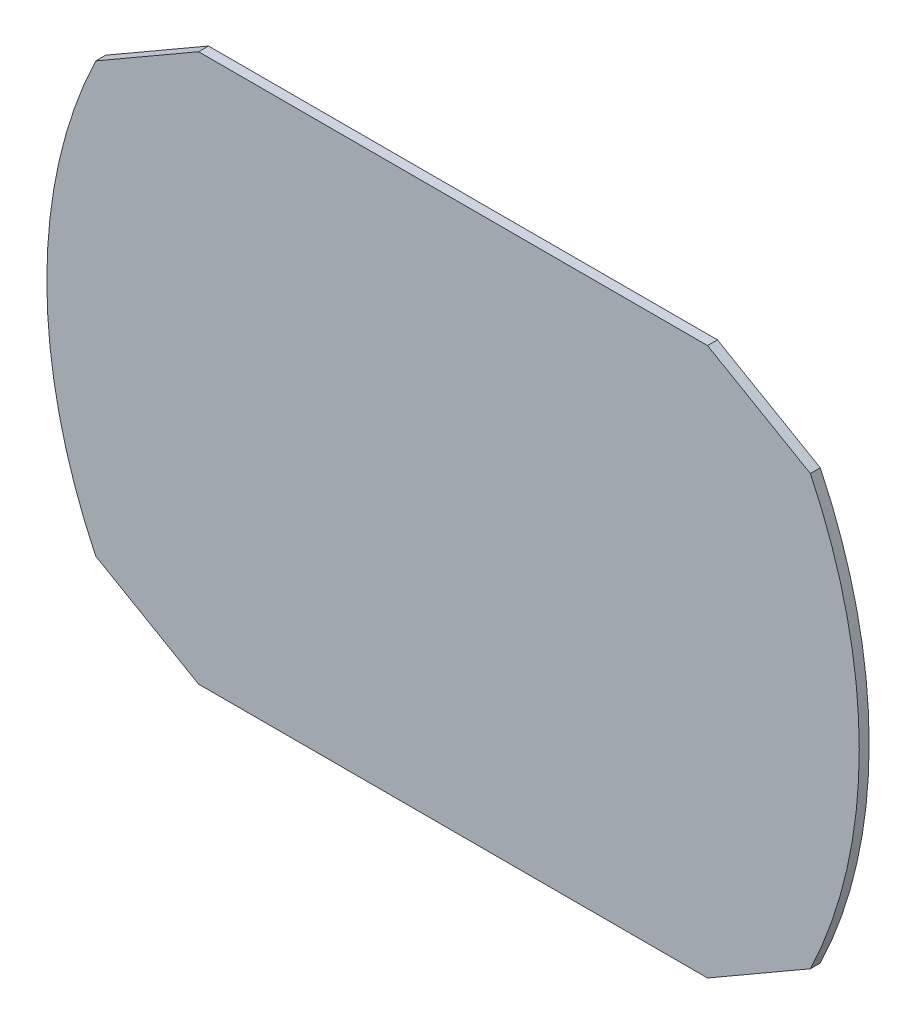
ISO-10303-21;
HEADER;
FILE_DESCRIPTION(('STEP AP214'),'2;1');
FILE_NAME('part.step','',(''),(''),'','','');
FILE_SCHEMA(('AUTOMOTIVE_DESIGN { 1 0 10303 214 1 1 1 1 }'));
ENDSEC;
DATA;
#1=APPLICATION_CONTEXT('core data for automotive mechanical design processes');
#2=APPLICATION_PROTOCOL_DEFINITION('international standard','automotive_design',2000,#1);
#3=PRODUCT_CONTEXT('',#1,'mechanical');
#4=PRODUCT('Part','Part','',(#3));
#5=PRODUCT_RELATED_PRODUCT_CATEGORY('part','',(#4));
#6=PRODUCT_DEFINITION_FORMATION('','',#4);
#7=PRODUCT_DEFINITION_CONTEXT('part definition',#1,'design');
#8=PRODUCT_DEFINITION('design','',#6,#7);
#9=PRODUCT_DEFINITION_SHAPE('','',#8);
#10=(LENGTH_UNIT() NAMED_UNIT(*) SI_UNIT(.MILLI.,.METRE.));
#11=(NAMED_UNIT(*) PLANE_ANGLE_UNIT() SI_UNIT($,.RADIAN.));
#12=(NAMED_UNIT(*) SI_UNIT($,.STERADIAN.) SOLID_ANGLE_UNIT());
#13=UNCERTAINTY_MEASURE_WITH_UNIT(LENGTH_MEASURE(1.E-05),#10,'distance_accuracy_value','');
#14=(GEOMETRIC_REPRESENTATION_CONTEXT(3) GLOBAL_UNCERTAINTY_ASSIGNED_CONTEXT((#13)) GLOBAL_UNIT_ASSIGNED_CONTEXT((#10,
#11,#12)) REPRESENTATION_CONTEXT('',''));
#15=CARTESIAN_POINT('',(0.,0.,0.));
#16=DIRECTION('',(0.,0.,1.));
#17=DIRECTION('',(1.,0.,0.));
#18=AXIS2_PLACEMENT_3D('',#15,#16,#17);
#19=CARTESIAN_POINT('',(65.,90.,3.));
#20=DIRECTION('',(-0.500000000000001,-0.866025403784438,0.));
#21=DIRECTION('',(0.866025403784438,-0.500000000000001,0.));
#22=AXIS2_PLACEMENT_3D('',#19,#20,#21);
#23=PLANE('',#22);
#24=DIRECTION('',(-0.866025403784438,0.500000000000001,0.));
#25=VECTOR('',#24,1.);
#26=CARTESIAN_POINT('',(65.,90.,0.));
#27=LINE('',#26,#25);
#28=CARTESIAN_POINT('',(108.301270189222,65.,0.));
#29=VERTEX_POINT('',#28);
#30=CARTESIAN_POINT('',(77.1243556529821,83.,0.));
#31=VERTEX_POINT('',#30);
#32=EDGE_CURVE('E138',#29,#31,#27,.T.);
#33=ORIENTED_EDGE('',*,*,#32,.T.);
#34=DIRECTION('',(0.,0.,1.));
#35=VECTOR('',#34,1.);
#36=CARTESIAN_POINT('',(77.1243556529821,83.,3.));
#37=LINE('',#36,#35);
#38=CARTESIAN_POINT('',(77.1243556529821,83.,3.));
#39=VERTEX_POINT('',#38);
#40=EDGE_CURVE('E64',#31,#39,#37,.T.);
#41=ORIENTED_EDGE('',*,*,#40,.T.);
#42=DIRECTION('',(-0.866025403784438,0.500000000000001,0.));
#43=VECTOR('',#42,1.);
#44=CARTESIAN_POINT('',(65.,90.,3.));
#45=LINE('',#44,#43);
#46=CARTESIAN_POINT('',(108.301270189222,65.,3.));
#47=VERTEX_POINT('',#46);
#48=EDGE_CURVE('E150',#47,#39,#45,.T.);
#49=ORIENTED_EDGE('',*,*,#48,.F.);
#50=DIRECTION('',(0.,0.,-1.));
#51=VECTOR('',#50,1.);
#52=CARTESIAN_POINT('',(108.301270189222,65.,3.));
#53=LINE('',#52,#51);
#54=EDGE_CURVE('E137',#47,#29,#53,.T.);
#55=ORIENTED_EDGE('',*,*,#54,.T.);
#56=EDGE_LOOP('',(#33,#41,#49,#55));
#57=FACE_BOUND('',#56,.T.);
#58=ADVANCED_FACE('F43',(#57),#23,.F.);
#59=CARTESIAN_POINT('',(-65.,90.,3.));
#60=DIRECTION('',(0.499999999999995,-0.866025403784442,0.));
#61=DIRECTION('',(0.866025403784442,0.499999999999995,0.));
#62=AXIS2_PLACEMENT_3D('',#59,#60,#61);
#63=PLANE('',#62);
#64=DIRECTION('',(-0.866025403784442,-0.499999999999995,0.));
#65=VECTOR('',#64,1.);
#66=CARTESIAN_POINT('',(-65.,90.,3.));
#67=LINE('',#66,#65);
#68=CARTESIAN_POINT('',(-77.1243556529823,83.,3.));
#69=VERTEX_POINT('',#68);
#70=CARTESIAN_POINT('',(-108.301270189222,65.0000000000003,3.));
#71=VERTEX_POINT('',#70);
#72=EDGE_CURVE('E132',#69,#71,#67,.T.);
#73=ORIENTED_EDGE('',*,*,#72,.F.);
#74=DIRECTION('',(0.,0.,-1.));
#75=VECTOR('',#74,1.);
#76=CARTESIAN_POINT('',(-77.1243556529823,83.,3.));
#77=LINE('',#76,#75);
#78=CARTESIAN_POINT('',(-77.1243556529823,83.,0.));
#79=VERTEX_POINT('',#78);
#80=EDGE_CURVE('E121',#69,#79,#77,.T.);
#81=ORIENTED_EDGE('',*,*,#80,.T.);
#82=DIRECTION('',(-0.866025403784442,-0.499999999999995,0.));
#83=VECTOR('',#82,1.);
#84=CARTESIAN_POINT('',(-65.,90.,0.));
#85=LINE('',#84,#83);
#86=CARTESIAN_POINT('',(-108.301270189222,65.0000000000003,0.));
#87=VERTEX_POINT('',#86);
#88=EDGE_CURVE('E141',#79,#87,#85,.T.);
#89=ORIENTED_EDGE('',*,*,#88,.T.);
#90=DIRECTION('',(0.,0.,-1.));
#91=VECTOR('',#90,1.);
#92=CARTESIAN_POINT('',(-108.301270189222,65.0000000000003,3.));
#93=LINE('',#92,#91);
#94=EDGE_CURVE('E158',#71,#87,#93,.T.);
#95=ORIENTED_EDGE('',*,*,#94,.F.);
#96=EDGE_LOOP('',(#73,#81,#89,#95));
#97=FACE_BOUND('',#96,.T.);
#98=ADVANCED_FACE('F185',(#97),#63,.F.);
#99=CARTESIAN_POINT('',(26.8837881567355,0.,3.));
#100=DIRECTION('',(0.,0.,-1.));
#101=DIRECTION('',(-1.,0.,0.));
#102=AXIS2_PLACEMENT_3D('',#99,#100,#101);
#103=CYLINDRICAL_SURFACE('',#102,150.);
#104=CARTESIAN_POINT('',(26.8837881567355,0.,0.));
#105=DIRECTION('',(0.,0.,1.));
#106=DIRECTION('',(1.,0.,0.));
#107=AXIS2_PLACEMENT_3D('',#104,#105,#106);
#108=CIRCLE('',#107,150.);
#109=CARTESIAN_POINT('',(-108.301270189222,-65.0000000000003,0.));
#110=VERTEX_POINT('',#109);
#111=EDGE_CURVE('E143',#87,#110,#108,.T.);
#112=ORIENTED_EDGE('',*,*,#111,.T.);
#113=DIRECTION('',(0.,0.,-1.));
#114=VECTOR('',#113,1.);
#115=CARTESIAN_POINT('',(-108.301270189222,-65.0000000000003,3.));
#116=LINE('',#115,#114);
#117=CARTESIAN_POINT('',(-108.301270189222,-65.0000000000003,3.));
#118=VERTEX_POINT('',#117);
#119=EDGE_CURVE('E156',#118,#110,#116,.T.);
#120=ORIENTED_EDGE('',*,*,#119,.F.);
#121=CARTESIAN_POINT('',(26.8837881567355,0.,3.));
#122=DIRECTION('',(0.,0.,1.));
#123=DIRECTION('',(1.,0.,0.));
#124=AXIS2_PLACEMENT_3D('',#121,#122,#123);
#125=CIRCLE('',#124,150.);
#126=EDGE_CURVE('E126',#71,#118,#125,.T.);
#127=ORIENTED_EDGE('',*,*,#126,.F.);
#128=ORIENTED_EDGE('',*,*,#94,.T.);
#129=EDGE_LOOP('',(#112,#120,#127,#128));
#130=FACE_BOUND('',#129,.T.);
#131=ADVANCED_FACE('F189',(#130),#103,.T.);
#132=CARTESIAN_POINT('',(-65.,-90.,3.));
#133=DIRECTION('',(0.499999999999994,0.866025403784442,0.));
#134=DIRECTION('',(-0.866025403784442,0.499999999999994,0.));
#135=AXIS2_PLACEMENT_3D('',#132,#133,#134);
#136=PLANE('',#135);
#137=DIRECTION('',(0.866025403784442,-0.499999999999994,0.));
#138=VECTOR('',#137,1.);
#139=CARTESIAN_POINT('',(-65.,-90.,0.));
#140=LINE('',#139,#138);
#141=CARTESIAN_POINT('',(-77.1243556529823,-83.,0.));
#142=VERTEX_POINT('',#141);
#143=EDGE_CURVE('E120',#110,#142,#140,.T.);
#144=ORIENTED_EDGE('',*,*,#143,.T.);
#145=DIRECTION('',(0.,0.,1.));
#146=VECTOR('',#145,1.);
#147=CARTESIAN_POINT('',(-77.1243556529823,-83.,3.));
#148=LINE('',#147,#146);
#149=CARTESIAN_POINT('',(-77.1243556529823,-83.,3.));
#150=VERTEX_POINT('',#149);
#151=EDGE_CURVE('E57',#142,#150,#148,.T.);
#152=ORIENTED_EDGE('',*,*,#151,.T.);
#153=DIRECTION('',(0.866025403784442,-0.499999999999994,0.));
#154=VECTOR('',#153,1.);
#155=CARTESIAN_POINT('',(-65.,-90.,3.));
#156=LINE('',#155,#154);
#157=EDGE_CURVE('E118',#118,#150,#156,.T.);
#158=ORIENTED_EDGE('',*,*,#157,.F.);
#159=ORIENTED_EDGE('',*,*,#119,.T.);
#160=EDGE_LOOP('',(#144,#152,#158,#159));
#161=FACE_BOUND('',#160,.T.);
#162=ADVANCED_FACE('F116',(#161),#136,.F.);
#163=CARTESIAN_POINT('',(65.,-90.,3.));
#164=DIRECTION('',(-0.499999999999997,0.86602540378444,0.));
#165=DIRECTION('',(-0.86602540378444,-0.499999999999997,0.));
#166=AXIS2_PLACEMENT_3D('',#163,#164,#165);
#167=PLANE('',#166);
#168=DIRECTION('',(0.866025403784441,0.499999999999997,0.));
#169=VECTOR('',#168,1.);
#170=CARTESIAN_POINT('',(65.,-90.,3.));
#171=LINE('',#170,#169);
#172=CARTESIAN_POINT('',(77.1243556529823,-83.,3.));
#173=VERTEX_POINT('',#172);
#174=CARTESIAN_POINT('',(108.301270189222,-65.0000000000002,3.));
#175=VERTEX_POINT('',#174);
#176=EDGE_CURVE('E128',#173,#175,#171,.T.);
#177=ORIENTED_EDGE('',*,*,#176,.F.);
#178=DIRECTION('',(0.,0.,-1.));
#179=VECTOR('',#178,1.);
#180=CARTESIAN_POINT('',(77.1243556529823,-83.,3.));
#181=LINE('',#180,#179);
#182=CARTESIAN_POINT('',(77.1243556529823,-83.,0.));
#183=VERTEX_POINT('',#182);
#184=EDGE_CURVE('E107',#173,#183,#181,.T.);
#185=ORIENTED_EDGE('',*,*,#184,.T.);
#186=DIRECTION('',(0.866025403784441,0.499999999999997,0.));
#187=VECTOR('',#186,1.);
#188=CARTESIAN_POINT('',(65.,-90.,0.));
#189=LINE('',#188,#187);
#190=CARTESIAN_POINT('',(108.301270189222,-65.0000000000002,0.));
#191=VERTEX_POINT('',#190);
#192=EDGE_CURVE('E146',#183,#191,#189,.T.);
#193=ORIENTED_EDGE('',*,*,#192,.T.);
#194=DIRECTION('',(0.,0.,-1.));
#195=VECTOR('',#194,1.);
#196=CARTESIAN_POINT('',(108.301270189222,-65.0000000000002,3.));
#197=LINE('',#196,#195);
#198=EDGE_CURVE('E153',#175,#191,#197,.T.);
#199=ORIENTED_EDGE('',*,*,#198,.F.);
#200=EDGE_LOOP('',(#177,#185,#193,#199));
#201=FACE_BOUND('',#200,.T.);
#202=ADVANCED_FACE('F163',(#201),#167,.F.);
#203=CARTESIAN_POINT('',(-26.8837881567357,-2.33965146947916E-13,3.));
#204=DIRECTION('',(0.,0.,-1.));
#205=DIRECTION('',(-1.,0.,0.));
#206=AXIS2_PLACEMENT_3D('',#203,#204,#205);
#207=CYLINDRICAL_SURFACE('',#206,150.);
#208=CARTESIAN_POINT('',(-26.8837881567357,-2.33965146947916E-13,0.));
#209=DIRECTION('',(0.,0.,1.));
#210=DIRECTION('',(-1.,0.,0.));
#211=AXIS2_PLACEMENT_3D('',#208,#209,#210);
#212=CIRCLE('',#211,150.);
#213=EDGE_CURVE('E148',#191,#29,#212,.T.);
#214=ORIENTED_EDGE('',*,*,#213,.T.);
#215=ORIENTED_EDGE('',*,*,#54,.F.);
#216=CARTESIAN_POINT('',(-26.8837881567357,-2.33965146947916E-13,3.));
#217=DIRECTION('',(0.,0.,1.));
#218=DIRECTION('',(-1.,0.,0.));
#219=AXIS2_PLACEMENT_3D('',#216,#217,#218);
#220=CIRCLE('',#219,150.);
#221=EDGE_CURVE('E130',#175,#47,#220,.T.);
#222=ORIENTED_EDGE('',*,*,#221,.F.);
#223=ORIENTED_EDGE('',*,*,#198,.T.);
#224=EDGE_LOOP('',(#214,#215,#222,#223));
#225=FACE_BOUND('',#224,.T.);
#226=ADVANCED_FACE('F171',(#225),#207,.T.);
#227=CARTESIAN_POINT('',(-26.8837881567357,-2.33965146947916E-13,3.));
#228=DIRECTION('',(0.,0.,-1.));
#229=DIRECTION('',(-1.,0.,0.));
#230=AXIS2_PLACEMENT_3D('',#227,#228,#229);
#231=PLANE('',#230);
#232=ORIENTED_EDGE('',*,*,#48,.T.);
#233=DIRECTION('',(1.,0.,0.));
#234=VECTOR('',#233,1.);
#235=CARTESIAN_POINT('',(-123.116211843264,83.,3.));
#236=LINE('',#235,#234);
#237=EDGE_CURVE('E111',#69,#39,#236,.T.);
#238=ORIENTED_EDGE('',*,*,#237,.F.);
#239=ORIENTED_EDGE('',*,*,#72,.T.);
#240=ORIENTED_EDGE('',*,*,#126,.T.);
#241=ORIENTED_EDGE('',*,*,#157,.T.);
#242=DIRECTION('',(1.,0.,0.));
#243=VECTOR('',#242,1.);
#244=CARTESIAN_POINT('',(-123.116211843264,-83.,3.));
#245=LINE('',#244,#243);
#246=EDGE_CURVE('E104',#150,#173,#245,.T.);
#247=ORIENTED_EDGE('',*,*,#246,.T.);
#248=ORIENTED_EDGE('',*,*,#176,.T.);
#249=ORIENTED_EDGE('',*,*,#221,.T.);
#250=EDGE_LOOP('',(#232,#238,#239,#240,#241,#247,#248,#249));
#251=FACE_BOUND('',#250,.T.);
#252=ADVANCED_FACE('F124',(#251),#231,.F.);
#253=CARTESIAN_POINT('',(-26.8837881567357,-2.33965146947916E-13,0.));
#254=DIRECTION('',(0.,0.,-1.));
#255=DIRECTION('',(-1.,0.,0.));
#256=AXIS2_PLACEMENT_3D('',#253,#254,#255);
#257=PLANE('',#256);
#258=DIRECTION('',(-1.,0.,0.));
#259=VECTOR('',#258,1.);
#260=CARTESIAN_POINT('',(-26.8837881567357,83.,0.));
#261=LINE('',#260,#259);
#262=EDGE_CURVE('E11',#31,#79,#261,.T.);
#263=ORIENTED_EDGE('',*,*,#262,.F.);
#264=ORIENTED_EDGE('',*,*,#32,.F.);
#265=ORIENTED_EDGE('',*,*,#213,.F.);
#266=ORIENTED_EDGE('',*,*,#192,.F.);
#267=DIRECTION('',(1.,0.,0.));
#268=VECTOR('',#267,1.);
#269=CARTESIAN_POINT('',(-26.8837881567357,-83.,0.));
#270=LINE('',#269,#268);
#271=EDGE_CURVE('E50',#142,#183,#270,.T.);
#272=ORIENTED_EDGE('',*,*,#271,.F.);
#273=ORIENTED_EDGE('',*,*,#143,.F.);
#274=ORIENTED_EDGE('',*,*,#111,.F.);
#275=ORIENTED_EDGE('',*,*,#88,.F.);
#276=EDGE_LOOP('',(#263,#264,#265,#266,#272,#273,#274,#275));
#277=FACE_BOUND('',#276,.T.);
#278=ADVANCED_FACE('F167',(#277),#257,.T.);
#279=CARTESIAN_POINT('',(-123.116211843264,-83.,3.));
#280=DIRECTION('',(0.,1.,0.));
#281=DIRECTION('',(0.,0.,1.));
#282=AXIS2_PLACEMENT_3D('',#279,#280,#281);
#283=PLANE('',#282);
#284=ORIENTED_EDGE('',*,*,#271,.T.);
#285=ORIENTED_EDGE('',*,*,#184,.F.);
#286=ORIENTED_EDGE('',*,*,#246,.F.);
#287=ORIENTED_EDGE('',*,*,#151,.F.);
#288=EDGE_LOOP('',(#284,#285,#286,#287));
#289=FACE_BOUND('',#288,.T.);
#290=ADVANCED_FACE('F105',(#289),#283,.F.);
#291=CARTESIAN_POINT('',(-123.116211843264,83.,3.));
#292=DIRECTION('',(0.,-1.,0.));
#293=DIRECTION('',(0.,0.,-1.));
#294=AXIS2_PLACEMENT_3D('',#291,#292,#293);
#295=PLANE('',#294);
#296=ORIENTED_EDGE('',*,*,#262,.T.);
#297=ORIENTED_EDGE('',*,*,#80,.F.);
#298=ORIENTED_EDGE('',*,*,#237,.T.);
#299=ORIENTED_EDGE('',*,*,#40,.F.);
#300=EDGE_LOOP('',(#296,#297,#298,#299));
#301=FACE_BOUND('',#300,.T.);
#302=ADVANCED_FACE('F181',(#301),#295,.F.);
#303=CLOSED_SHELL('',(#58,#98,#131,#162,#202,#226,#252,#278,#290,#302));
#304=MANIFOLD_SOLID_BREP('B2',#303);
#305=ADVANCED_BREP_SHAPE_REPRESENTATION('',(#18,#304),#14);
#306=SHAPE_DEFINITION_REPRESENTATION(#9,#305);
ENDSEC;
END-ISO-10303-21;
